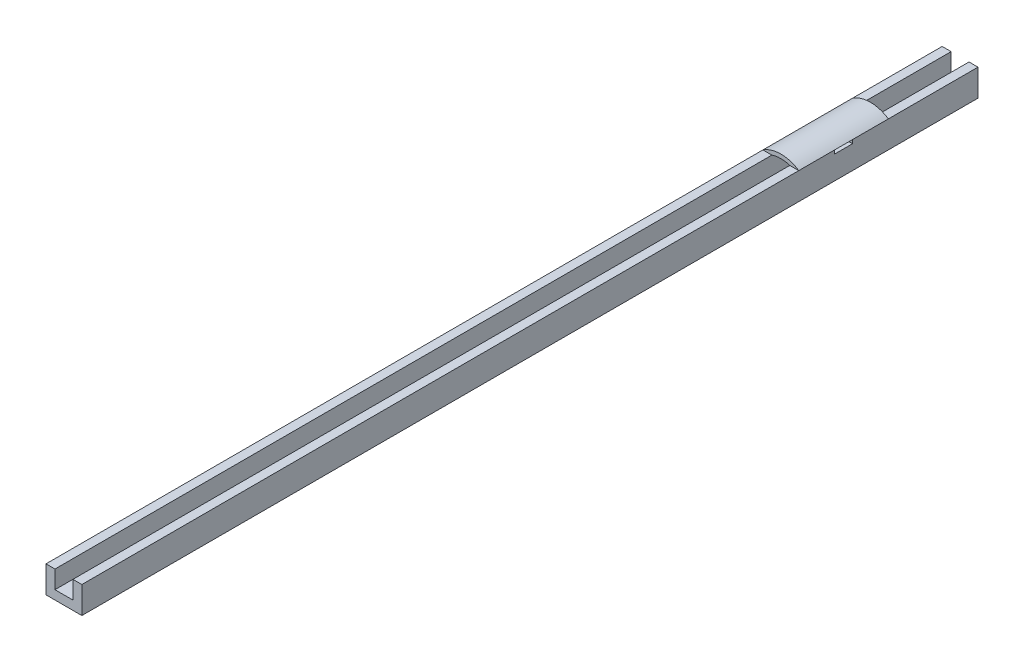
ISO-10303-21;
HEADER;
FILE_DESCRIPTION(('STEP AP214'),'2;1');
FILE_NAME('part.step','',(''),(''),'','','');
FILE_SCHEMA(('AUTOMOTIVE_DESIGN { 1 0 10303 214 1 1 1 1 }'));
ENDSEC;
DATA;
#1=APPLICATION_CONTEXT('core data for automotive mechanical design processes');
#2=APPLICATION_PROTOCOL_DEFINITION('international standard','automotive_design',2000,#1);
#3=PRODUCT_CONTEXT('',#1,'mechanical');
#4=PRODUCT('Part','Part','',(#3));
#5=PRODUCT_RELATED_PRODUCT_CATEGORY('part','',(#4));
#6=PRODUCT_DEFINITION_FORMATION('','',#4);
#7=PRODUCT_DEFINITION_CONTEXT('part definition',#1,'design');
#8=PRODUCT_DEFINITION('design','',#6,#7);
#9=PRODUCT_DEFINITION_SHAPE('','',#8);
#10=(LENGTH_UNIT() NAMED_UNIT(*) SI_UNIT(.MILLI.,.METRE.));
#11=(NAMED_UNIT(*) PLANE_ANGLE_UNIT() SI_UNIT($,.RADIAN.));
#12=(NAMED_UNIT(*) SI_UNIT($,.STERADIAN.) SOLID_ANGLE_UNIT());
#13=UNCERTAINTY_MEASURE_WITH_UNIT(LENGTH_MEASURE(1.E-05),#10,'distance_accuracy_value','');
#14=(GEOMETRIC_REPRESENTATION_CONTEXT(3) GLOBAL_UNCERTAINTY_ASSIGNED_CONTEXT((#13)) GLOBAL_UNIT_ASSIGNED_CONTEXT((#10,
#11,#12)) REPRESENTATION_CONTEXT('',''));
#15=CARTESIAN_POINT('',(0.,0.,0.));
#16=DIRECTION('',(0.,0.,1.));
#17=DIRECTION('',(1.,0.,0.));
#18=AXIS2_PLACEMENT_3D('',#15,#16,#17);
#19=CARTESIAN_POINT('',(20.,20.,1000.));
#20=DIRECTION('',(-1.,0.,0.));
#21=DIRECTION('',(0.,0.,1.));
#22=AXIS2_PLACEMENT_3D('',#19,#20,#21);
#23=PLANE('',#22);
#24=DIRECTION('',(0.,1.,0.));
#25=VECTOR('',#24,1.);
#26=CARTESIAN_POINT('',(20.,20.,140.));
#27=LINE('',#26,#25);
#28=CARTESIAN_POINT('',(20.,16.,140.));
#29=VERTEX_POINT('',#28);
#30=CARTESIAN_POINT('',(20.,20.,140.));
#31=VERTEX_POINT('',#30);
#32=EDGE_CURVE('E199',#29,#31,#27,.T.);
#33=ORIENTED_EDGE('',*,*,#32,.F.);
#34=DIRECTION('',(0.,0.,-1.));
#35=VECTOR('',#34,1.);
#36=CARTESIAN_POINT('',(20.,16.0000000000001,1000.));
#37=LINE('',#36,#35);
#38=CARTESIAN_POINT('',(20.,16.,160.));
#39=VERTEX_POINT('',#38);
#40=EDGE_CURVE('E162',#39,#29,#37,.T.);
#41=ORIENTED_EDGE('',*,*,#40,.F.);
#42=DIRECTION('',(0.,-1.,0.));
#43=VECTOR('',#42,1.);
#44=CARTESIAN_POINT('',(20.,20.,160.));
#45=LINE('',#44,#43);
#46=CARTESIAN_POINT('',(20.,20.,160.));
#47=VERTEX_POINT('',#46);
#48=EDGE_CURVE('E408',#47,#39,#45,.T.);
#49=ORIENTED_EDGE('',*,*,#48,.F.);
#50=DIRECTION('',(0.,0.,-1.));
#51=VECTOR('',#50,1.);
#52=CARTESIAN_POINT('',(20.,20.,200.));
#53=LINE('',#52,#51);
#54=CARTESIAN_POINT('',(20.,20.,200.));
#55=VERTEX_POINT('',#54);
#56=EDGE_CURVE('E232',#55,#47,#53,.T.);
#57=ORIENTED_EDGE('',*,*,#56,.F.);
#58=DIRECTION('',(0.,0.,-1.));
#59=VECTOR('',#58,1.);
#60=CARTESIAN_POINT('',(20.,20.,1000.));
#61=LINE('',#60,#59);
#62=CARTESIAN_POINT('',(20.,20.,1000.));
#63=VERTEX_POINT('',#62);
#64=EDGE_CURVE('E311',#63,#55,#61,.T.);
#65=ORIENTED_EDGE('',*,*,#64,.F.);
#66=DIRECTION('',(0.,1.,0.));
#67=VECTOR('',#66,1.);
#68=CARTESIAN_POINT('',(20.,20.,1000.));
#69=LINE('',#68,#67);
#70=CARTESIAN_POINT('',(20.,-10.,1000.));
#71=VERTEX_POINT('',#70);
#72=EDGE_CURVE('E264',#71,#63,#69,.T.);
#73=ORIENTED_EDGE('',*,*,#72,.F.);
#74=DIRECTION('',(0.,0.,-1.));
#75=VECTOR('',#74,1.);
#76=CARTESIAN_POINT('',(20.,-10.,1000.));
#77=LINE('',#76,#75);
#78=CARTESIAN_POINT('',(20.,-10.,0.));
#79=VERTEX_POINT('',#78);
#80=EDGE_CURVE('E315',#71,#79,#77,.T.);
#81=ORIENTED_EDGE('',*,*,#80,.T.);
#82=DIRECTION('',(0.,1.,0.));
#83=VECTOR('',#82,1.);
#84=CARTESIAN_POINT('',(20.,20.,0.));
#85=LINE('',#84,#83);
#86=CARTESIAN_POINT('',(20.,20.,0.));
#87=VERTEX_POINT('',#86);
#88=EDGE_CURVE('E291',#79,#87,#85,.T.);
#89=ORIENTED_EDGE('',*,*,#88,.T.);
#90=CARTESIAN_POINT('',(20.,20.,100.));
#91=VERTEX_POINT('',#90);
#92=EDGE_CURVE('E310',#91,#87,#61,.T.);
#93=ORIENTED_EDGE('',*,*,#92,.F.);
#94=EDGE_CURVE('E218',#31,#91,#53,.T.);
#95=ORIENTED_EDGE('',*,*,#94,.F.);
#96=EDGE_LOOP('',(#33,#41,#49,#57,#65,#73,#81,#89,#93,#95));
#97=FACE_BOUND('',#96,.T.);
#98=ADVANCED_FACE('F40',(#97),#23,.F.);
#99=CARTESIAN_POINT('',(10.,0.,1000.));
#100=DIRECTION('',(1.,0.,0.));
#101=DIRECTION('',(0.,0.,-1.));
#102=AXIS2_PLACEMENT_3D('',#99,#100,#101);
#103=PLANE('',#102);
#104=DIRECTION('',(0.,1.,0.));
#105=VECTOR('',#104,1.);
#106=CARTESIAN_POINT('',(10.,16.,140.));
#107=LINE('',#106,#105);
#108=CARTESIAN_POINT('',(10.,16.,140.));
#109=VERTEX_POINT('',#108);
#110=CARTESIAN_POINT('',(10.,20.,140.));
#111=VERTEX_POINT('',#110);
#112=EDGE_CURVE('E168',#109,#111,#107,.T.);
#113=ORIENTED_EDGE('',*,*,#112,.T.);
#114=DIRECTION('',(0.,0.,-1.));
#115=VECTOR('',#114,1.);
#116=CARTESIAN_POINT('',(10.,20.,200.));
#117=LINE('',#116,#115);
#118=CARTESIAN_POINT('',(10.,20.,100.));
#119=VERTEX_POINT('',#118);
#120=EDGE_CURVE('E236',#111,#119,#117,.T.);
#121=ORIENTED_EDGE('',*,*,#120,.T.);
#122=DIRECTION('',(0.,0.,-1.));
#123=VECTOR('',#122,1.);
#124=CARTESIAN_POINT('',(10.,20.,1000.));
#125=LINE('',#124,#123);
#126=CARTESIAN_POINT('',(10.,20.,0.));
#127=VERTEX_POINT('',#126);
#128=EDGE_CURVE('E305',#119,#127,#125,.T.);
#129=ORIENTED_EDGE('',*,*,#128,.T.);
#130=DIRECTION('',(0.,-1.,0.));
#131=VECTOR('',#130,1.);
#132=CARTESIAN_POINT('',(10.,0.,0.));
#133=LINE('',#132,#131);
#134=CARTESIAN_POINT('',(10.,0.,0.));
#135=VERTEX_POINT('',#134);
#136=EDGE_CURVE('E252',#127,#135,#133,.T.);
#137=ORIENTED_EDGE('',*,*,#136,.T.);
#138=DIRECTION('',(0.,0.,-1.));
#139=VECTOR('',#138,1.);
#140=CARTESIAN_POINT('',(10.,0.,1000.));
#141=LINE('',#140,#139);
#142=CARTESIAN_POINT('',(10.,0.,1000.));
#143=VERTEX_POINT('',#142);
#144=EDGE_CURVE('E273',#143,#135,#141,.T.);
#145=ORIENTED_EDGE('',*,*,#144,.F.);
#146=DIRECTION('',(0.,-1.,0.));
#147=VECTOR('',#146,1.);
#148=CARTESIAN_POINT('',(10.,0.,1000.));
#149=LINE('',#148,#147);
#150=CARTESIAN_POINT('',(10.,20.,1000.));
#151=VERTEX_POINT('',#150);
#152=EDGE_CURVE('E270',#151,#143,#149,.T.);
#153=ORIENTED_EDGE('',*,*,#152,.F.);
#154=CARTESIAN_POINT('',(10.,20.,200.));
#155=VERTEX_POINT('',#154);
#156=EDGE_CURVE('E306',#151,#155,#125,.T.);
#157=ORIENTED_EDGE('',*,*,#156,.T.);
#158=CARTESIAN_POINT('',(10.,20.,160.));
#159=VERTEX_POINT('',#158);
#160=EDGE_CURVE('E237',#155,#159,#117,.T.);
#161=ORIENTED_EDGE('',*,*,#160,.T.);
#162=DIRECTION('',(0.,-1.,0.));
#163=VECTOR('',#162,1.);
#164=CARTESIAN_POINT('',(10.,16.,160.));
#165=LINE('',#164,#163);
#166=CARTESIAN_POINT('',(10.,16.,160.));
#167=VERTEX_POINT('',#166);
#168=EDGE_CURVE('E64',#159,#167,#165,.T.);
#169=ORIENTED_EDGE('',*,*,#168,.T.);
#170=DIRECTION('',(0.,0.,-1.));
#171=VECTOR('',#170,1.);
#172=CARTESIAN_POINT('',(10.,16.,160.));
#173=LINE('',#172,#171);
#174=EDGE_CURVE('E160',#167,#109,#173,.T.);
#175=ORIENTED_EDGE('',*,*,#174,.T.);
#176=EDGE_LOOP('',(#113,#121,#129,#137,#145,#153,#157,#161,#169,#175));
#177=FACE_BOUND('',#176,.T.);
#178=ADVANCED_FACE('F175',(#177),#103,.F.);
#179=CARTESIAN_POINT('',(-10.,20.,1000.));
#180=DIRECTION('',(0.,-1.,0.));
#181=DIRECTION('',(0.,0.,-1.));
#182=AXIS2_PLACEMENT_3D('',#179,#180,#181);
#183=PLANE('',#182);
#184=DIRECTION('',(1.,0.,0.));
#185=VECTOR('',#184,1.);
#186=CARTESIAN_POINT('',(-20.,20.,200.));
#187=LINE('',#186,#185);
#188=CARTESIAN_POINT('',(-20.,20.,200.));
#189=VERTEX_POINT('',#188);
#190=CARTESIAN_POINT('',(-10.,20.,200.));
#191=VERTEX_POINT('',#190);
#192=EDGE_CURVE('E208',#189,#191,#187,.T.);
#193=ORIENTED_EDGE('',*,*,#192,.F.);
#194=DIRECTION('',(0.,0.,-1.));
#195=VECTOR('',#194,1.);
#196=CARTESIAN_POINT('',(-20.,20.,1000.));
#197=LINE('',#196,#195);
#198=CARTESIAN_POINT('',(-20.,20.,1000.));
#199=VERTEX_POINT('',#198);
#200=EDGE_CURVE('E324',#199,#189,#197,.T.);
#201=ORIENTED_EDGE('',*,*,#200,.F.);
#202=DIRECTION('',(-1.,0.,0.));
#203=VECTOR('',#202,1.);
#204=CARTESIAN_POINT('',(-10.,20.,1000.));
#205=LINE('',#204,#203);
#206=CARTESIAN_POINT('',(-10.,20.,1000.));
#207=VERTEX_POINT('',#206);
#208=EDGE_CURVE('E255',#207,#199,#205,.T.);
#209=ORIENTED_EDGE('',*,*,#208,.F.);
#210=DIRECTION('',(0.,0.,-1.));
#211=VECTOR('',#210,1.);
#212=CARTESIAN_POINT('',(-10.,20.,1000.));
#213=LINE('',#212,#211);
#214=EDGE_CURVE('E49',#207,#191,#213,.T.);
#215=ORIENTED_EDGE('',*,*,#214,.T.);
#216=EDGE_LOOP('',(#193,#201,#209,#215));
#217=FACE_BOUND('',#216,.T.);
#218=ADVANCED_FACE('F365',(#217),#183,.F.);
#219=CARTESIAN_POINT('',(10.,20.,1000.));
#220=DIRECTION('',(0.,-1.,0.));
#221=DIRECTION('',(0.,0.,-1.));
#222=AXIS2_PLACEMENT_3D('',#219,#220,#221);
#223=PLANE('',#222);
#224=DIRECTION('',(1.,0.,0.));
#225=VECTOR('',#224,1.);
#226=CARTESIAN_POINT('',(10.,20.,200.));
#227=LINE('',#226,#225);
#228=EDGE_CURVE('E215',#155,#55,#227,.T.);
#229=ORIENTED_EDGE('',*,*,#228,.F.);
#230=ORIENTED_EDGE('',*,*,#156,.F.);
#231=DIRECTION('',(-1.,0.,0.));
#232=VECTOR('',#231,1.);
#233=CARTESIAN_POINT('',(10.,20.,1000.));
#234=LINE('',#233,#232);
#235=EDGE_CURVE('E267',#63,#151,#234,.T.);
#236=ORIENTED_EDGE('',*,*,#235,.F.);
#237=ORIENTED_EDGE('',*,*,#64,.T.);
#238=EDGE_LOOP('',(#229,#230,#236,#237));
#239=FACE_BOUND('',#238,.T.);
#240=ADVANCED_FACE('F395',(#239),#223,.F.);
#241=CARTESIAN_POINT('',(0.,0.,1000.));
#242=DIRECTION('',(0.,-1.,0.));
#243=DIRECTION('',(1.,0.,0.));
#244=AXIS2_PLACEMENT_3D('',#241,#242,#243);
#245=PLANE('',#244);
#246=DIRECTION('',(-1.,0.,0.));
#247=VECTOR('',#246,1.);
#248=CARTESIAN_POINT('',(0.,0.,0.));
#249=LINE('',#248,#247);
#250=CARTESIAN_POINT('',(-10.,0.,0.));
#251=VERTEX_POINT('',#250);
#252=EDGE_CURVE('E247',#135,#251,#249,.T.);
#253=ORIENTED_EDGE('',*,*,#252,.T.);
#254=DIRECTION('',(0.,0.,-1.));
#255=VECTOR('',#254,1.);
#256=CARTESIAN_POINT('',(-10.,0.,1000.));
#257=LINE('',#256,#255);
#258=CARTESIAN_POINT('',(-10.,0.,1000.));
#259=VERTEX_POINT('',#258);
#260=EDGE_CURVE('E12',#259,#251,#257,.T.);
#261=ORIENTED_EDGE('',*,*,#260,.F.);
#262=DIRECTION('',(-1.,0.,0.));
#263=VECTOR('',#262,1.);
#264=CARTESIAN_POINT('',(10.,0.,1000.));
#265=LINE('',#264,#263);
#266=EDGE_CURVE('E248',#143,#259,#265,.T.);
#267=ORIENTED_EDGE('',*,*,#266,.F.);
#268=ORIENTED_EDGE('',*,*,#144,.T.);
#269=EDGE_LOOP('',(#253,#261,#267,#268));
#270=FACE_BOUND('',#269,.T.);
#271=ADVANCED_FACE('F42',(#270),#245,.F.);
#272=CARTESIAN_POINT('',(-10.,0.,1000.));
#273=DIRECTION('',(-1.,0.,0.));
#274=DIRECTION('',(0.,0.,1.));
#275=AXIS2_PLACEMENT_3D('',#272,#273,#274);
#276=PLANE('',#275);
#277=DIRECTION('',(0.,1.,0.));
#278=VECTOR('',#277,1.);
#279=CARTESIAN_POINT('',(-10.,0.,0.));
#280=LINE('',#279,#278);
#281=CARTESIAN_POINT('',(-10.,20.,0.));
#282=VERTEX_POINT('',#281);
#283=EDGE_CURVE('E276',#251,#282,#280,.T.);
#284=ORIENTED_EDGE('',*,*,#283,.T.);
#285=CARTESIAN_POINT('',(-10.,20.,100.));
#286=VERTEX_POINT('',#285);
#287=EDGE_CURVE('E327',#286,#282,#213,.T.);
#288=ORIENTED_EDGE('',*,*,#287,.F.);
#289=DIRECTION('',(0.,0.,-1.));
#290=VECTOR('',#289,1.);
#291=CARTESIAN_POINT('',(-10.,20.,200.));
#292=LINE('',#291,#290);
#293=EDGE_CURVE('E240',#191,#286,#292,.T.);
#294=ORIENTED_EDGE('',*,*,#293,.F.);
#295=ORIENTED_EDGE('',*,*,#214,.F.);
#296=DIRECTION('',(0.,1.,0.));
#297=VECTOR('',#296,1.);
#298=CARTESIAN_POINT('',(-10.,0.,1000.));
#299=LINE('',#298,#297);
#300=EDGE_CURVE('E251',#259,#207,#299,.T.);
#301=ORIENTED_EDGE('',*,*,#300,.F.);
#302=ORIENTED_EDGE('',*,*,#260,.T.);
#303=EDGE_LOOP('',(#284,#288,#294,#295,#301,#302));
#304=FACE_BOUND('',#303,.T.);
#305=ADVANCED_FACE('F345',(#304),#276,.F.);
#306=CARTESIAN_POINT('',(-20.,20.,100.));
#307=VERTEX_POINT('',#306);
#308=CARTESIAN_POINT('',(-20.,20.,0.));
#309=VERTEX_POINT('',#308);
#310=EDGE_CURVE('E323',#307,#309,#197,.T.);
#311=ORIENTED_EDGE('',*,*,#310,.F.);
#312=DIRECTION('',(1.,0.,0.));
#313=VECTOR('',#312,1.);
#314=CARTESIAN_POINT('',(-20.,20.,100.));
#315=LINE('',#314,#313);
#316=EDGE_CURVE('E221',#307,#286,#315,.T.);
#317=ORIENTED_EDGE('',*,*,#316,.T.);
#318=ORIENTED_EDGE('',*,*,#287,.T.);
#319=DIRECTION('',(-1.,0.,0.));
#320=VECTOR('',#319,1.);
#321=CARTESIAN_POINT('',(-10.,20.,0.));
#322=LINE('',#321,#320);
#323=EDGE_CURVE('E280',#282,#309,#322,.T.);
#324=ORIENTED_EDGE('',*,*,#323,.T.);
#325=EDGE_LOOP('',(#311,#317,#318,#324));
#326=FACE_BOUND('',#325,.T.);
#327=ADVANCED_FACE('F338',(#326),#183,.F.);
#328=CARTESIAN_POINT('',(-20.,20.,1000.));
#329=DIRECTION('',(1.,0.,0.));
#330=DIRECTION('',(0.,0.,-1.));
#331=AXIS2_PLACEMENT_3D('',#328,#329,#330);
#332=PLANE('',#331);
#333=DIRECTION('',(0.,-1.,0.));
#334=VECTOR('',#333,1.);
#335=CARTESIAN_POINT('',(-20.,20.,0.));
#336=LINE('',#335,#334);
#337=CARTESIAN_POINT('',(-20.,-10.,0.));
#338=VERTEX_POINT('',#337);
#339=EDGE_CURVE('E284',#309,#338,#336,.T.);
#340=ORIENTED_EDGE('',*,*,#339,.T.);
#341=DIRECTION('',(0.,0.,-1.));
#342=VECTOR('',#341,1.);
#343=CARTESIAN_POINT('',(-20.,-10.,1000.));
#344=LINE('',#343,#342);
#345=CARTESIAN_POINT('',(-20.,-10.,1000.));
#346=VERTEX_POINT('',#345);
#347=EDGE_CURVE('E319',#346,#338,#344,.T.);
#348=ORIENTED_EDGE('',*,*,#347,.F.);
#349=DIRECTION('',(0.,-1.,0.));
#350=VECTOR('',#349,1.);
#351=CARTESIAN_POINT('',(-20.,20.,1000.));
#352=LINE('',#351,#350);
#353=EDGE_CURVE('E258',#199,#346,#352,.T.);
#354=ORIENTED_EDGE('',*,*,#353,.F.);
#355=ORIENTED_EDGE('',*,*,#200,.T.);
#356=DIRECTION('',(0.,0.,-1.));
#357=VECTOR('',#356,1.);
#358=CARTESIAN_POINT('',(-20.,20.,200.));
#359=LINE('',#358,#357);
#360=EDGE_CURVE('E243',#189,#307,#359,.T.);
#361=ORIENTED_EDGE('',*,*,#360,.T.);
#362=ORIENTED_EDGE('',*,*,#310,.T.);
#363=EDGE_LOOP('',(#340,#348,#354,#355,#361,#362));
#364=FACE_BOUND('',#363,.T.);
#365=ADVANCED_FACE('F353',(#364),#332,.F.);
#366=CARTESIAN_POINT('',(20.,-10.,1000.));
#367=DIRECTION('',(0.,1.,0.));
#368=DIRECTION('',(-1.,0.,0.));
#369=AXIS2_PLACEMENT_3D('',#366,#367,#368);
#370=PLANE('',#369);
#371=DIRECTION('',(1.,0.,0.));
#372=VECTOR('',#371,1.);
#373=CARTESIAN_POINT('',(20.,-10.,0.));
#374=LINE('',#373,#372);
#375=EDGE_CURVE('E288',#338,#79,#374,.T.);
#376=ORIENTED_EDGE('',*,*,#375,.T.);
#377=ORIENTED_EDGE('',*,*,#80,.F.);
#378=DIRECTION('',(1.,0.,0.));
#379=VECTOR('',#378,1.);
#380=CARTESIAN_POINT('',(-20.,-10.,1000.));
#381=LINE('',#380,#379);
#382=EDGE_CURVE('E261',#346,#71,#381,.T.);
#383=ORIENTED_EDGE('',*,*,#382,.F.);
#384=ORIENTED_EDGE('',*,*,#347,.T.);
#385=EDGE_LOOP('',(#376,#377,#383,#384));
#386=FACE_BOUND('',#385,.T.);
#387=ADVANCED_FACE('F357',(#386),#370,.F.);
#388=ORIENTED_EDGE('',*,*,#128,.F.);
#389=DIRECTION('',(1.,0.,0.));
#390=VECTOR('',#389,1.);
#391=CARTESIAN_POINT('',(10.,20.,100.));
#392=LINE('',#391,#390);
#393=EDGE_CURVE('E209',#119,#91,#392,.T.);
#394=ORIENTED_EDGE('',*,*,#393,.T.);
#395=ORIENTED_EDGE('',*,*,#92,.T.);
#396=DIRECTION('',(-1.,0.,0.));
#397=VECTOR('',#396,1.);
#398=CARTESIAN_POINT('',(10.,20.,0.));
#399=LINE('',#398,#397);
#400=EDGE_CURVE('E295',#87,#127,#399,.T.);
#401=ORIENTED_EDGE('',*,*,#400,.T.);
#402=EDGE_LOOP('',(#388,#394,#395,#401));
#403=FACE_BOUND('',#402,.T.);
#404=ADVANCED_FACE('F386',(#403),#223,.F.);
#405=CARTESIAN_POINT('',(0.,0.,1000.));
#406=DIRECTION('',(0.,0.,-1.));
#407=DIRECTION('',(-1.,0.,0.));
#408=AXIS2_PLACEMENT_3D('',#405,#406,#407);
#409=PLANE('',#408);
#410=ORIENTED_EDGE('',*,*,#266,.T.);
#411=ORIENTED_EDGE('',*,*,#300,.T.);
#412=ORIENTED_EDGE('',*,*,#208,.T.);
#413=ORIENTED_EDGE('',*,*,#353,.T.);
#414=ORIENTED_EDGE('',*,*,#382,.T.);
#415=ORIENTED_EDGE('',*,*,#72,.T.);
#416=ORIENTED_EDGE('',*,*,#235,.T.);
#417=ORIENTED_EDGE('',*,*,#152,.T.);
#418=EDGE_LOOP('',(#410,#411,#412,#413,#414,#415,#416,#417));
#419=FACE_BOUND('',#418,.T.);
#420=ADVANCED_FACE('F361',(#419),#409,.F.);
#421=CARTESIAN_POINT('',(0.,0.,0.));
#422=DIRECTION('',(0.,0.,-1.));
#423=DIRECTION('',(-1.,0.,0.));
#424=AXIS2_PLACEMENT_3D('',#421,#422,#423);
#425=PLANE('',#424);
#426=ORIENTED_EDGE('',*,*,#252,.F.);
#427=ORIENTED_EDGE('',*,*,#136,.F.);
#428=ORIENTED_EDGE('',*,*,#400,.F.);
#429=ORIENTED_EDGE('',*,*,#88,.F.);
#430=ORIENTED_EDGE('',*,*,#375,.F.);
#431=ORIENTED_EDGE('',*,*,#339,.F.);
#432=ORIENTED_EDGE('',*,*,#323,.F.);
#433=ORIENTED_EDGE('',*,*,#283,.F.);
#434=EDGE_LOOP('',(#426,#427,#428,#429,#430,#431,#432,#433));
#435=FACE_BOUND('',#434,.T.);
#436=ADVANCED_FACE('F349',(#435),#425,.T.);
#437=CARTESIAN_POINT('',(0.,-10.,200.));
#438=DIRECTION('',(0.,0.,-1.));
#439=DIRECTION('',(-1.,0.,0.));
#440=AXIS2_PLACEMENT_3D('',#437,#438,#439);
#441=CYLINDRICAL_SURFACE('',#440,36.0555127546399);
#442=CARTESIAN_POINT('',(0.,-10.,100.));
#443=DIRECTION('',(0.,0.,1.));
#444=DIRECTION('',(-1.,0.,0.));
#445=AXIS2_PLACEMENT_3D('',#442,#443,#444);
#446=CIRCLE('',#445,36.0555127546399);
#447=EDGE_CURVE('E204',#91,#307,#446,.T.);
#448=ORIENTED_EDGE('',*,*,#447,.T.);
#449=ORIENTED_EDGE('',*,*,#360,.F.);
#450=CARTESIAN_POINT('',(0.,-10.,200.));
#451=DIRECTION('',(0.,0.,1.));
#452=DIRECTION('',(-1.,0.,0.));
#453=AXIS2_PLACEMENT_3D('',#450,#451,#452);
#454=CIRCLE('',#453,36.0555127546399);
#455=EDGE_CURVE('E205',#55,#189,#454,.T.);
#456=ORIENTED_EDGE('',*,*,#455,.F.);
#457=ORIENTED_EDGE('',*,*,#56,.T.);
#458=DIRECTION('',(0.,0.,-1.));
#459=VECTOR('',#458,1.);
#460=CARTESIAN_POINT('',(20.,20.,200.));
#461=LINE('',#460,#459);
#462=EDGE_CURVE('E197',#31,#47,#461,.F.);
#463=ORIENTED_EDGE('',*,*,#462,.F.);
#464=ORIENTED_EDGE('',*,*,#94,.T.);
#465=EDGE_LOOP('',(#448,#449,#456,#457,#463,#464));
#466=FACE_BOUND('',#465,.T.);
#467=ADVANCED_FACE('F397',(#466),#441,.T.);
#468=CARTESIAN_POINT('',(0.,-10.,200.));
#469=DIRECTION('',(0.,0.,-1.));
#470=DIRECTION('',(-1.,0.,0.));
#471=AXIS2_PLACEMENT_3D('',#468,#469,#470);
#472=CYLINDRICAL_SURFACE('',#471,31.6227766016838);
#473=CARTESIAN_POINT('',(0.,-10.,100.));
#474=DIRECTION('',(0.,0.,-1.));
#475=DIRECTION('',(-1.,0.,0.));
#476=AXIS2_PLACEMENT_3D('',#473,#474,#475);
#477=CIRCLE('',#476,31.6227766016838);
#478=EDGE_CURVE('E225',#286,#119,#477,.T.);
#479=ORIENTED_EDGE('',*,*,#478,.T.);
#480=ORIENTED_EDGE('',*,*,#120,.F.);
#481=DIRECTION('',(0.,0.,1.));
#482=VECTOR('',#481,1.);
#483=CARTESIAN_POINT('',(10.,20.,160.));
#484=LINE('',#483,#482);
#485=EDGE_CURVE('E173',#111,#159,#484,.T.);
#486=ORIENTED_EDGE('',*,*,#485,.T.);
#487=ORIENTED_EDGE('',*,*,#160,.F.);
#488=CARTESIAN_POINT('',(0.,-10.,200.));
#489=DIRECTION('',(0.,0.,-1.));
#490=DIRECTION('',(-1.,0.,0.));
#491=AXIS2_PLACEMENT_3D('',#488,#489,#490);
#492=CIRCLE('',#491,31.6227766016838);
#493=EDGE_CURVE('E212',#191,#155,#492,.T.);
#494=ORIENTED_EDGE('',*,*,#493,.F.);
#495=ORIENTED_EDGE('',*,*,#293,.T.);
#496=EDGE_LOOP('',(#479,#480,#486,#487,#494,#495));
#497=FACE_BOUND('',#496,.T.);
#498=ADVANCED_FACE('F372',(#497),#472,.F.);
#499=CARTESIAN_POINT('',(0.,-10.,200.));
#500=DIRECTION('',(0.,0.,-1.));
#501=DIRECTION('',(-1.,0.,0.));
#502=AXIS2_PLACEMENT_3D('',#499,#500,#501);
#503=PLANE('',#502);
#504=ORIENTED_EDGE('',*,*,#455,.T.);
#505=ORIENTED_EDGE('',*,*,#192,.T.);
#506=ORIENTED_EDGE('',*,*,#493,.T.);
#507=ORIENTED_EDGE('',*,*,#228,.T.);
#508=EDGE_LOOP('',(#504,#505,#506,#507));
#509=FACE_BOUND('',#508,.T.);
#510=ADVANCED_FACE('F368',(#509),#503,.F.);
#511=CARTESIAN_POINT('',(0.,-10.,100.));
#512=DIRECTION('',(0.,0.,-1.));
#513=DIRECTION('',(-1.,0.,0.));
#514=AXIS2_PLACEMENT_3D('',#511,#512,#513);
#515=PLANE('',#514);
#516=ORIENTED_EDGE('',*,*,#447,.F.);
#517=ORIENTED_EDGE('',*,*,#393,.F.);
#518=ORIENTED_EDGE('',*,*,#478,.F.);
#519=ORIENTED_EDGE('',*,*,#316,.F.);
#520=EDGE_LOOP('',(#516,#517,#518,#519));
#521=FACE_BOUND('',#520,.T.);
#522=ADVANCED_FACE('F401',(#521),#515,.T.);
#523=CARTESIAN_POINT('',(29.9999999999727,16.,160.));
#524=DIRECTION('',(0.,1.,0.));
#525=DIRECTION('',(-1.,0.,0.));
#526=AXIS2_PLACEMENT_3D('',#523,#524,#525);
#527=PLANE('',#526);
#528=ORIENTED_EDGE('',*,*,#40,.T.);
#529=DIRECTION('',(-1.,0.,0.));
#530=VECTOR('',#529,1.);
#531=CARTESIAN_POINT('',(29.9999999999727,16.,140.));
#532=LINE('',#531,#530);
#533=EDGE_CURVE('E155',#29,#109,#532,.T.);
#534=ORIENTED_EDGE('',*,*,#533,.T.);
#535=ORIENTED_EDGE('',*,*,#174,.F.);
#536=DIRECTION('',(-1.,0.,0.));
#537=VECTOR('',#536,1.);
#538=CARTESIAN_POINT('',(29.9999999999727,16.,160.));
#539=LINE('',#538,#537);
#540=EDGE_CURVE('E183',#39,#167,#539,.T.);
#541=ORIENTED_EDGE('',*,*,#540,.F.);
#542=EDGE_LOOP('',(#528,#534,#535,#541));
#543=FACE_BOUND('',#542,.T.);
#544=ADVANCED_FACE('F157',(#543),#527,.T.);
#545=CARTESIAN_POINT('',(29.9999999999727,16.,140.));
#546=DIRECTION('',(0.,0.,1.));
#547=DIRECTION('',(1.,0.,0.));
#548=AXIS2_PLACEMENT_3D('',#545,#546,#547);
#549=PLANE('',#548);
#550=ORIENTED_EDGE('',*,*,#32,.T.);
#551=DIRECTION('',(-1.,0.,0.));
#552=VECTOR('',#551,1.);
#553=CARTESIAN_POINT('',(29.9999999999727,20.,140.));
#554=LINE('',#553,#552);
#555=EDGE_CURVE('E56',#31,#111,#554,.T.);
#556=ORIENTED_EDGE('',*,*,#555,.T.);
#557=ORIENTED_EDGE('',*,*,#112,.F.);
#558=ORIENTED_EDGE('',*,*,#533,.F.);
#559=EDGE_LOOP('',(#550,#556,#557,#558));
#560=FACE_BOUND('',#559,.T.);
#561=ADVANCED_FACE('F169',(#560),#549,.T.);
#562=CARTESIAN_POINT('',(29.9999999999727,20.,160.));
#563=DIRECTION('',(0.,-1.,0.));
#564=DIRECTION('',(1.,0.,0.));
#565=AXIS2_PLACEMENT_3D('',#562,#563,#564);
#566=PLANE('',#565);
#567=ORIENTED_EDGE('',*,*,#462,.T.);
#568=DIRECTION('',(-1.,0.,0.));
#569=VECTOR('',#568,1.);
#570=CARTESIAN_POINT('',(29.9999999999727,20.,160.));
#571=LINE('',#570,#569);
#572=EDGE_CURVE('E187',#47,#159,#571,.T.);
#573=ORIENTED_EDGE('',*,*,#572,.T.);
#574=ORIENTED_EDGE('',*,*,#485,.F.);
#575=ORIENTED_EDGE('',*,*,#555,.F.);
#576=EDGE_LOOP('',(#567,#573,#574,#575));
#577=FACE_BOUND('',#576,.T.);
#578=ADVANCED_FACE('F411',(#577),#566,.T.);
#579=CARTESIAN_POINT('',(29.9999999999727,16.,160.));
#580=DIRECTION('',(0.,0.,-1.));
#581=DIRECTION('',(-1.,0.,0.));
#582=AXIS2_PLACEMENT_3D('',#579,#580,#581);
#583=PLANE('',#582);
#584=ORIENTED_EDGE('',*,*,#48,.T.);
#585=ORIENTED_EDGE('',*,*,#540,.T.);
#586=ORIENTED_EDGE('',*,*,#168,.F.);
#587=ORIENTED_EDGE('',*,*,#572,.F.);
#588=EDGE_LOOP('',(#584,#585,#586,#587));
#589=FACE_BOUND('',#588,.T.);
#590=ADVANCED_FACE('F414',(#589),#583,.T.);
#591=CLOSED_SHELL('',(#98,#178,#218,#240,#271,#305,#327,#365,#387,#404,#420,#436,#467,#498,#510,
#522,#544,#561,#578,#590));
#592=MANIFOLD_SOLID_BREP('B2',#591);
#593=ADVANCED_BREP_SHAPE_REPRESENTATION('',(#18,#592),#14);
#594=SHAPE_DEFINITION_REPRESENTATION(#9,#593);
ENDSEC;
END-ISO-10303-21;
